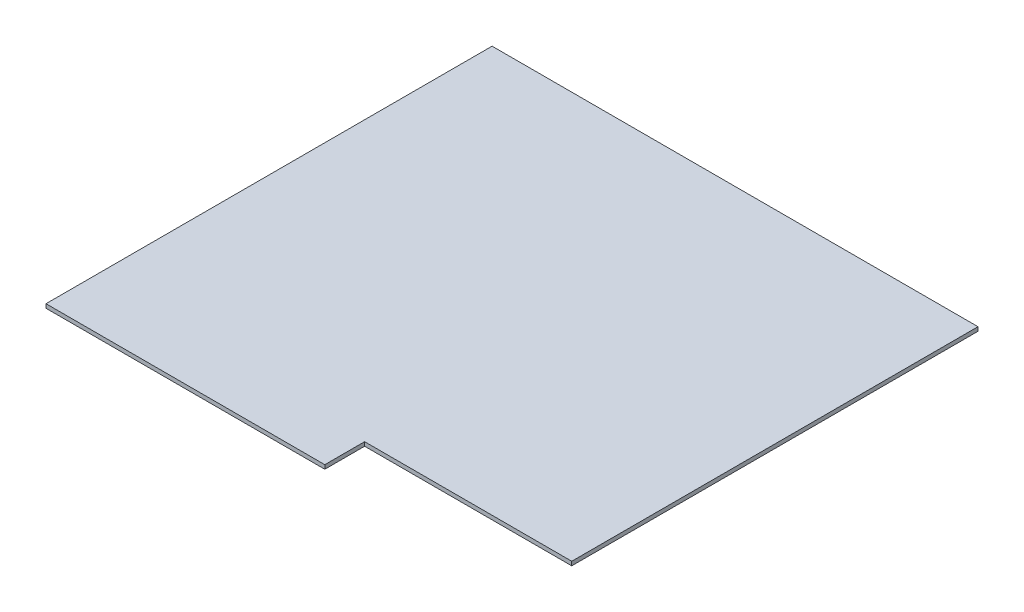
ISO-10303-21;
HEADER;
FILE_DESCRIPTION(('STEP AP214'),'2;1');
FILE_NAME('part.step','',(''),(''),'','','');
FILE_SCHEMA(('AUTOMOTIVE_DESIGN { 1 0 10303 214 1 1 1 1 }'));
ENDSEC;
DATA;
#1=APPLICATION_CONTEXT('core data for automotive mechanical design processes');
#2=APPLICATION_PROTOCOL_DEFINITION('international standard','automotive_design',2000,#1);
#3=PRODUCT_CONTEXT('',#1,'mechanical');
#4=PRODUCT('Part','Part','',(#3));
#5=PRODUCT_RELATED_PRODUCT_CATEGORY('part','',(#4));
#6=PRODUCT_DEFINITION_FORMATION('','',#4);
#7=PRODUCT_DEFINITION_CONTEXT('part definition',#1,'design');
#8=PRODUCT_DEFINITION('design','',#6,#7);
#9=PRODUCT_DEFINITION_SHAPE('','',#8);
#10=(LENGTH_UNIT() NAMED_UNIT(*) SI_UNIT(.MILLI.,.METRE.));
#11=(NAMED_UNIT(*) PLANE_ANGLE_UNIT() SI_UNIT($,.RADIAN.));
#12=(NAMED_UNIT(*) SI_UNIT($,.STERADIAN.) SOLID_ANGLE_UNIT());
#13=UNCERTAINTY_MEASURE_WITH_UNIT(LENGTH_MEASURE(1.E-05),#10,'distance_accuracy_value','');
#14=(GEOMETRIC_REPRESENTATION_CONTEXT(3) GLOBAL_UNCERTAINTY_ASSIGNED_CONTEXT((#13)) GLOBAL_UNIT_ASSIGNED_CONTEXT((#10,
#11,#12)) REPRESENTATION_CONTEXT('',''));
#15=CARTESIAN_POINT('',(0.,0.,0.));
#16=DIRECTION('',(0.,0.,1.));
#17=DIRECTION('',(1.,0.,0.));
#18=AXIS2_PLACEMENT_3D('',#15,#16,#17);
#19=CARTESIAN_POINT('',(-2978.65691651514,50.,2869.08001274914));
#20=DIRECTION('',(1.,0.,0.));
#21=DIRECTION('',(0.,0.,-1.));
#22=AXIS2_PLACEMENT_3D('',#19,#20,#21);
#23=PLANE('',#22);
#24=DIRECTION('',(0.,0.,1.));
#25=VECTOR('',#24,1.);
#26=CARTESIAN_POINT('',(-2978.65691651514,0.,2869.08001274914));
#27=LINE('',#26,#25);
#28=CARTESIAN_POINT('',(-2978.65691651514,0.,-2730.91998725086));
#29=VERTEX_POINT('',#28);
#30=CARTESIAN_POINT('',(-2978.65691651514,0.,2869.08001274914));
#31=VERTEX_POINT('',#30);
#32=EDGE_CURVE('E169',#29,#31,#27,.T.);
#33=ORIENTED_EDGE('',*,*,#32,.T.);
#34=DIRECTION('',(0.,-1.,0.));
#35=VECTOR('',#34,1.);
#36=CARTESIAN_POINT('',(-2978.65691651514,50.,2869.08001274914));
#37=LINE('',#36,#35);
#38=CARTESIAN_POINT('',(-2978.65691651514,50.,2869.08001274914));
#39=VERTEX_POINT('',#38);
#40=EDGE_CURVE('E11',#39,#31,#37,.T.);
#41=ORIENTED_EDGE('',*,*,#40,.F.);
#42=DIRECTION('',(0.,0.,1.));
#43=VECTOR('',#42,1.);
#44=CARTESIAN_POINT('',(-2978.65691651514,50.,2869.08001274914));
#45=LINE('',#44,#43);
#46=CARTESIAN_POINT('',(-2978.65691651514,50.,-2730.91998725086));
#47=VERTEX_POINT('',#46);
#48=EDGE_CURVE('E202',#47,#39,#45,.T.);
#49=ORIENTED_EDGE('',*,*,#48,.F.);
#50=DIRECTION('',(0.,-1.,0.));
#51=VECTOR('',#50,1.);
#52=CARTESIAN_POINT('',(-2978.65691651514,50.,-2730.91998725086));
#53=LINE('',#52,#51);
#54=EDGE_CURVE('E216',#47,#29,#53,.T.);
#55=ORIENTED_EDGE('',*,*,#54,.T.);
#56=EDGE_LOOP('',(#33,#41,#49,#55));
#57=FACE_BOUND('',#56,.T.);
#58=ADVANCED_FACE('F33',(#57),#23,.F.);
#59=CARTESIAN_POINT('',(521.343083484864,50.,2869.08001274914));
#60=DIRECTION('',(0.,0.,-1.));
#61=DIRECTION('',(-1.,0.,0.));
#62=AXIS2_PLACEMENT_3D('',#59,#60,#61);
#63=PLANE('',#62);
#64=DIRECTION('',(1.,0.,0.));
#65=VECTOR('',#64,1.);
#66=CARTESIAN_POINT('',(521.343083484864,0.,2869.08001274914));
#67=LINE('',#66,#65);
#68=CARTESIAN_POINT('',(521.343083484864,0.,2869.08001274914));
#69=VERTEX_POINT('',#68);
#70=EDGE_CURVE('E219',#31,#69,#67,.T.);
#71=ORIENTED_EDGE('',*,*,#70,.T.);
#72=DIRECTION('',(0.,-1.,0.));
#73=VECTOR('',#72,1.);
#74=CARTESIAN_POINT('',(521.343083484864,50.,2869.08001274914));
#75=LINE('',#74,#73);
#76=CARTESIAN_POINT('',(521.343083484864,50.,2869.08001274914));
#77=VERTEX_POINT('',#76);
#78=EDGE_CURVE('E40',#77,#69,#75,.T.);
#79=ORIENTED_EDGE('',*,*,#78,.F.);
#80=DIRECTION('',(1.,0.,0.));
#81=VECTOR('',#80,1.);
#82=CARTESIAN_POINT('',(521.343083484864,50.,2869.08001274914));
#83=LINE('',#82,#81);
#84=EDGE_CURVE('E205',#39,#77,#83,.T.);
#85=ORIENTED_EDGE('',*,*,#84,.F.);
#86=ORIENTED_EDGE('',*,*,#40,.T.);
#87=EDGE_LOOP('',(#71,#79,#85,#86));
#88=FACE_BOUND('',#87,.T.);
#89=ADVANCED_FACE('F266',(#88),#63,.F.);
#90=CARTESIAN_POINT('',(521.343083484864,50.,2369.08001274914));
#91=DIRECTION('',(-1.,0.,0.));
#92=DIRECTION('',(0.,0.,1.));
#93=AXIS2_PLACEMENT_3D('',#90,#91,#92);
#94=PLANE('',#93);
#95=DIRECTION('',(0.,0.,-1.));
#96=VECTOR('',#95,1.);
#97=CARTESIAN_POINT('',(521.343083484864,0.,2369.08001274914));
#98=LINE('',#97,#96);
#99=CARTESIAN_POINT('',(521.343083484864,0.,2369.08001274914));
#100=VERTEX_POINT('',#99);
#101=EDGE_CURVE('E221',#69,#100,#98,.T.);
#102=ORIENTED_EDGE('',*,*,#101,.T.);
#103=DIRECTION('',(0.,-1.,0.));
#104=VECTOR('',#103,1.);
#105=CARTESIAN_POINT('',(521.343083484864,50.,2369.08001274914));
#106=LINE('',#105,#104);
#107=CARTESIAN_POINT('',(521.343083484864,50.,2369.08001274914));
#108=VERTEX_POINT('',#107);
#109=EDGE_CURVE('E236',#108,#100,#106,.T.);
#110=ORIENTED_EDGE('',*,*,#109,.F.);
#111=DIRECTION('',(0.,0.,-1.));
#112=VECTOR('',#111,1.);
#113=CARTESIAN_POINT('',(521.343083484864,50.,2369.08001274914));
#114=LINE('',#113,#112);
#115=EDGE_CURVE('E208',#77,#108,#114,.T.);
#116=ORIENTED_EDGE('',*,*,#115,.F.);
#117=ORIENTED_EDGE('',*,*,#78,.T.);
#118=EDGE_LOOP('',(#102,#110,#116,#117));
#119=FACE_BOUND('',#118,.T.);
#120=ADVANCED_FACE('F243',(#119),#94,.F.);
#121=CARTESIAN_POINT('',(3121.34308348486,50.,2369.08001274914));
#122=DIRECTION('',(0.,0.,-1.));
#123=DIRECTION('',(-1.,0.,0.));
#124=AXIS2_PLACEMENT_3D('',#121,#122,#123);
#125=PLANE('',#124);
#126=DIRECTION('',(1.,0.,0.));
#127=VECTOR('',#126,1.);
#128=CARTESIAN_POINT('',(3121.34308348486,0.,2369.08001274914));
#129=LINE('',#128,#127);
#130=CARTESIAN_POINT('',(3121.34308348486,0.,2369.08001274914));
#131=VERTEX_POINT('',#130);
#132=EDGE_CURVE('E223',#100,#131,#129,.T.);
#133=ORIENTED_EDGE('',*,*,#132,.T.);
#134=DIRECTION('',(0.,-1.,0.));
#135=VECTOR('',#134,1.);
#136=CARTESIAN_POINT('',(3121.34308348486,50.,2369.08001274914));
#137=LINE('',#136,#135);
#138=CARTESIAN_POINT('',(3121.34308348486,50.,2369.08001274914));
#139=VERTEX_POINT('',#138);
#140=EDGE_CURVE('E233',#139,#131,#137,.T.);
#141=ORIENTED_EDGE('',*,*,#140,.F.);
#142=DIRECTION('',(1.,0.,0.));
#143=VECTOR('',#142,1.);
#144=CARTESIAN_POINT('',(3121.34308348486,50.,2369.08001274914));
#145=LINE('',#144,#143);
#146=EDGE_CURVE('E210',#108,#139,#145,.T.);
#147=ORIENTED_EDGE('',*,*,#146,.F.);
#148=ORIENTED_EDGE('',*,*,#109,.T.);
#149=EDGE_LOOP('',(#133,#141,#147,#148));
#150=FACE_BOUND('',#149,.T.);
#151=ADVANCED_FACE('F254',(#150),#125,.F.);
#152=CARTESIAN_POINT('',(3121.34308348486,50.,2369.08001274914));
#153=DIRECTION('',(-1.,0.,0.));
#154=DIRECTION('',(0.,0.,1.));
#155=AXIS2_PLACEMENT_3D('',#152,#153,#154);
#156=PLANE('',#155);
#157=DIRECTION('',(0.,0.,-1.));
#158=VECTOR('',#157,1.);
#159=CARTESIAN_POINT('',(3121.34308348486,0.,2369.08001274914));
#160=LINE('',#159,#158);
#161=CARTESIAN_POINT('',(3121.34308348486,0.,-2730.91998725086));
#162=VERTEX_POINT('',#161);
#163=EDGE_CURVE('E225',#131,#162,#160,.T.);
#164=ORIENTED_EDGE('',*,*,#163,.T.);
#165=DIRECTION('',(0.,-1.,0.));
#166=VECTOR('',#165,1.);
#167=CARTESIAN_POINT('',(3121.34308348486,50.,-2730.91998725086));
#168=LINE('',#167,#166);
#169=CARTESIAN_POINT('',(3121.34308348486,50.,-2730.91998725086));
#170=VERTEX_POINT('',#169);
#171=EDGE_CURVE('E230',#170,#162,#168,.T.);
#172=ORIENTED_EDGE('',*,*,#171,.F.);
#173=DIRECTION('',(0.,0.,-1.));
#174=VECTOR('',#173,1.);
#175=CARTESIAN_POINT('',(3121.34308348486,50.,2369.08001274914));
#176=LINE('',#175,#174);
#177=EDGE_CURVE('E212',#139,#170,#176,.T.);
#178=ORIENTED_EDGE('',*,*,#177,.F.);
#179=ORIENTED_EDGE('',*,*,#140,.T.);
#180=EDGE_LOOP('',(#164,#172,#178,#179));
#181=FACE_BOUND('',#180,.T.);
#182=ADVANCED_FACE('F258',(#181),#156,.F.);
#183=CARTESIAN_POINT('',(3121.34308348486,50.,-2730.91998725086));
#184=DIRECTION('',(0.,0.,1.));
#185=DIRECTION('',(1.,0.,0.));
#186=AXIS2_PLACEMENT_3D('',#183,#184,#185);
#187=PLANE('',#186);
#188=DIRECTION('',(-1.,0.,0.));
#189=VECTOR('',#188,1.);
#190=CARTESIAN_POINT('',(3121.34308348486,0.,-2730.91998725086));
#191=LINE('',#190,#189);
#192=EDGE_CURVE('E206',#162,#29,#191,.T.);
#193=ORIENTED_EDGE('',*,*,#192,.T.);
#194=ORIENTED_EDGE('',*,*,#54,.F.);
#195=DIRECTION('',(-1.,0.,0.));
#196=VECTOR('',#195,1.);
#197=CARTESIAN_POINT('',(3121.34308348486,50.,-2730.91998725086));
#198=LINE('',#197,#196);
#199=EDGE_CURVE('E214',#170,#47,#198,.T.);
#200=ORIENTED_EDGE('',*,*,#199,.F.);
#201=ORIENTED_EDGE('',*,*,#171,.T.);
#202=EDGE_LOOP('',(#193,#194,#200,#201));
#203=FACE_BOUND('',#202,.T.);
#204=ADVANCED_FACE('F269',(#203),#187,.F.);
#205=CARTESIAN_POINT('',(0.,50.,0.));
#206=DIRECTION('',(0.,1.,0.));
#207=DIRECTION('',(0.,0.,1.));
#208=AXIS2_PLACEMENT_3D('',#205,#206,#207);
#209=PLANE('',#208);
#210=ORIENTED_EDGE('',*,*,#48,.T.);
#211=ORIENTED_EDGE('',*,*,#84,.T.);
#212=ORIENTED_EDGE('',*,*,#115,.T.);
#213=ORIENTED_EDGE('',*,*,#146,.T.);
#214=ORIENTED_EDGE('',*,*,#177,.T.);
#215=ORIENTED_EDGE('',*,*,#199,.T.);
#216=EDGE_LOOP('',(#210,#211,#212,#213,#214,#215));
#217=FACE_BOUND('',#216,.T.);
#218=ADVANCED_FACE('F262',(#217),#209,.T.);
#219=CARTESIAN_POINT('',(0.,0.,0.));
#220=DIRECTION('',(0.,1.,0.));
#221=DIRECTION('',(0.,0.,1.));
#222=AXIS2_PLACEMENT_3D('',#219,#220,#221);
#223=PLANE('',#222);
#224=DIRECTION('',(-1.,0.,0.));
#225=VECTOR('',#224,1.);
#226=CARTESIAN_POINT('',(-1828.65691651514,0.,194.080012749139));
#227=LINE('',#226,#225);
#228=CARTESIAN_POINT('',(-1078.65691651514,0.,194.080012749139));
#229=VERTEX_POINT('',#228);
#230=CARTESIAN_POINT('',(-1828.65691651514,0.,194.080012749139));
#231=VERTEX_POINT('',#230);
#232=EDGE_CURVE('E162',#229,#231,#227,.T.);
#233=ORIENTED_EDGE('',*,*,#232,.F.);
#234=DIRECTION('',(0.,0.,1.));
#235=VECTOR('',#234,1.);
#236=CARTESIAN_POINT('',(-1078.65691651514,0.,-555.919987250861));
#237=LINE('',#236,#235);
#238=CARTESIAN_POINT('',(-1078.65691651514,0.,-555.919987250861));
#239=VERTEX_POINT('',#238);
#240=EDGE_CURVE('E47',#239,#229,#237,.T.);
#241=ORIENTED_EDGE('',*,*,#240,.F.);
#242=DIRECTION('',(1.,0.,0.));
#243=VECTOR('',#242,1.);
#244=CARTESIAN_POINT('',(-1828.65691651514,0.,-555.919987250861));
#245=LINE('',#244,#243);
#246=CARTESIAN_POINT('',(-1828.65691651514,0.,-555.919987250861));
#247=VERTEX_POINT('',#246);
#248=EDGE_CURVE('E153',#247,#239,#245,.T.);
#249=ORIENTED_EDGE('',*,*,#248,.F.);
#250=DIRECTION('',(0.,0.,-1.));
#251=VECTOR('',#250,1.);
#252=CARTESIAN_POINT('',(-1828.65691651514,0.,-555.919987250861));
#253=LINE('',#252,#251);
#254=EDGE_CURVE('E156',#231,#247,#253,.T.);
#255=ORIENTED_EDGE('',*,*,#254,.F.);
#256=EDGE_LOOP('',(#233,#241,#249,#255));
#257=FACE_BOUND('',#256,.T.);
#258=DIRECTION('',(1.,0.,0.));
#259=VECTOR('',#258,1.);
#260=CARTESIAN_POINT('',(1971.34308348486,0.,-555.91998725086));
#261=LINE('',#260,#259);
#262=CARTESIAN_POINT('',(1221.34308348486,0.,-555.919987250861));
#263=VERTEX_POINT('',#262);
#264=CARTESIAN_POINT('',(1971.34308348486,0.,-555.91998725086));
#265=VERTEX_POINT('',#264);
#266=EDGE_CURVE('E188',#263,#265,#261,.T.);
#267=ORIENTED_EDGE('',*,*,#266,.F.);
#268=DIRECTION('',(0.,0.,-1.));
#269=VECTOR('',#268,1.);
#270=CARTESIAN_POINT('',(1221.34308348486,0.,-555.919987250861));
#271=LINE('',#270,#269);
#272=CARTESIAN_POINT('',(1221.34308348486,0.,194.080012749139));
#273=VERTEX_POINT('',#272);
#274=EDGE_CURVE('E55',#273,#263,#271,.T.);
#275=ORIENTED_EDGE('',*,*,#274,.F.);
#276=DIRECTION('',(-1.,0.,0.));
#277=VECTOR('',#276,1.);
#278=CARTESIAN_POINT('',(1971.34308348486,0.,194.08001274914));
#279=LINE('',#278,#277);
#280=CARTESIAN_POINT('',(1971.34308348486,0.,194.08001274914));
#281=VERTEX_POINT('',#280);
#282=EDGE_CURVE('E177',#281,#273,#279,.T.);
#283=ORIENTED_EDGE('',*,*,#282,.F.);
#284=DIRECTION('',(0.,0.,1.));
#285=VECTOR('',#284,1.);
#286=CARTESIAN_POINT('',(1971.34308348486,0.,-555.91998725086));
#287=LINE('',#286,#285);
#288=EDGE_CURVE('E191',#265,#281,#287,.T.);
#289=ORIENTED_EDGE('',*,*,#288,.F.);
#290=EDGE_LOOP('',(#267,#275,#283,#289));
#291=FACE_BOUND('',#290,.T.);
#292=ORIENTED_EDGE('',*,*,#32,.F.);
#293=ORIENTED_EDGE('',*,*,#192,.F.);
#294=ORIENTED_EDGE('',*,*,#163,.F.);
#295=ORIENTED_EDGE('',*,*,#132,.F.);
#296=ORIENTED_EDGE('',*,*,#101,.F.);
#297=ORIENTED_EDGE('',*,*,#70,.F.);
#298=EDGE_LOOP('',(#292,#293,#294,#295,#296,#297));
#299=FACE_BOUND('',#298,.T.);
#300=ADVANCED_FACE('F249',(#257,#291,#299),#223,.F.);
#301=CARTESIAN_POINT('',(1221.34308348486,10.,-555.919987250861));
#302=DIRECTION('',(-1.,0.,0.));
#303=DIRECTION('',(0.,0.,1.));
#304=AXIS2_PLACEMENT_3D('',#301,#302,#303);
#305=PLANE('',#304);
#306=ORIENTED_EDGE('',*,*,#274,.T.);
#307=DIRECTION('',(0.,-1.,0.));
#308=VECTOR('',#307,1.);
#309=CARTESIAN_POINT('',(1221.34308348486,10.,-555.919987250861));
#310=LINE('',#309,#308);
#311=CARTESIAN_POINT('',(1221.34308348486,10.,-555.919987250861));
#312=VERTEX_POINT('',#311);
#313=EDGE_CURVE('E186',#312,#263,#310,.T.);
#314=ORIENTED_EDGE('',*,*,#313,.F.);
#315=DIRECTION('',(0.,0.,-1.));
#316=VECTOR('',#315,1.);
#317=CARTESIAN_POINT('',(1221.34308348486,10.,-555.919987250861));
#318=LINE('',#317,#316);
#319=CARTESIAN_POINT('',(1221.34308348486,10.,194.080012749139));
#320=VERTEX_POINT('',#319);
#321=EDGE_CURVE('E173',#320,#312,#318,.T.);
#322=ORIENTED_EDGE('',*,*,#321,.F.);
#323=DIRECTION('',(0.,-1.,0.));
#324=VECTOR('',#323,1.);
#325=CARTESIAN_POINT('',(1221.34308348486,10.,194.080012749139));
#326=LINE('',#325,#324);
#327=EDGE_CURVE('E163',#320,#273,#326,.T.);
#328=ORIENTED_EDGE('',*,*,#327,.T.);
#329=EDGE_LOOP('',(#306,#314,#322,#328));
#330=FACE_BOUND('',#329,.T.);
#331=ADVANCED_FACE('F316',(#330),#305,.F.);
#332=CARTESIAN_POINT('',(1971.34308348486,10.,194.08001274914));
#333=DIRECTION('',(0.,0.,1.));
#334=DIRECTION('',(1.,0.,0.));
#335=AXIS2_PLACEMENT_3D('',#332,#333,#334);
#336=PLANE('',#335);
#337=ORIENTED_EDGE('',*,*,#282,.T.);
#338=ORIENTED_EDGE('',*,*,#327,.F.);
#339=DIRECTION('',(-1.,0.,0.));
#340=VECTOR('',#339,1.);
#341=CARTESIAN_POINT('',(1971.34308348486,10.,194.08001274914));
#342=LINE('',#341,#340);
#343=CARTESIAN_POINT('',(1971.34308348486,10.,194.08001274914));
#344=VERTEX_POINT('',#343);
#345=EDGE_CURVE('E183',#344,#320,#342,.T.);
#346=ORIENTED_EDGE('',*,*,#345,.F.);
#347=DIRECTION('',(0.,-1.,0.));
#348=VECTOR('',#347,1.);
#349=CARTESIAN_POINT('',(1971.34308348486,10.,194.08001274914));
#350=LINE('',#349,#348);
#351=EDGE_CURVE('E197',#344,#281,#350,.T.);
#352=ORIENTED_EDGE('',*,*,#351,.T.);
#353=EDGE_LOOP('',(#337,#338,#346,#352));
#354=FACE_BOUND('',#353,.T.);
#355=ADVANCED_FACE('F325',(#354),#336,.F.);
#356=CARTESIAN_POINT('',(1971.34308348486,10.,-555.91998725086));
#357=DIRECTION('',(1.,0.,0.));
#358=DIRECTION('',(0.,0.,-1.));
#359=AXIS2_PLACEMENT_3D('',#356,#357,#358);
#360=PLANE('',#359);
#361=ORIENTED_EDGE('',*,*,#288,.T.);
#362=ORIENTED_EDGE('',*,*,#351,.F.);
#363=DIRECTION('',(0.,0.,1.));
#364=VECTOR('',#363,1.);
#365=CARTESIAN_POINT('',(1971.34308348486,10.,-555.91998725086));
#366=LINE('',#365,#364);
#367=CARTESIAN_POINT('',(1971.34308348486,10.,-555.91998725086));
#368=VERTEX_POINT('',#367);
#369=EDGE_CURVE('E180',#368,#344,#366,.T.);
#370=ORIENTED_EDGE('',*,*,#369,.F.);
#371=DIRECTION('',(0.,-1.,0.));
#372=VECTOR('',#371,1.);
#373=CARTESIAN_POINT('',(1971.34308348486,10.,-555.91998725086));
#374=LINE('',#373,#372);
#375=EDGE_CURVE('E199',#368,#265,#374,.T.);
#376=ORIENTED_EDGE('',*,*,#375,.T.);
#377=EDGE_LOOP('',(#361,#362,#370,#376));
#378=FACE_BOUND('',#377,.T.);
#379=ADVANCED_FACE('F334',(#378),#360,.F.);
#380=CARTESIAN_POINT('',(1971.34308348486,10.,-555.91998725086));
#381=DIRECTION('',(0.,0.,-1.));
#382=DIRECTION('',(-1.,0.,0.));
#383=AXIS2_PLACEMENT_3D('',#380,#381,#382);
#384=PLANE('',#383);
#385=ORIENTED_EDGE('',*,*,#266,.T.);
#386=ORIENTED_EDGE('',*,*,#375,.F.);
#387=DIRECTION('',(1.,0.,0.));
#388=VECTOR('',#387,1.);
#389=CARTESIAN_POINT('',(1971.34308348486,10.,-555.91998725086));
#390=LINE('',#389,#388);
#391=EDGE_CURVE('E176',#312,#368,#390,.T.);
#392=ORIENTED_EDGE('',*,*,#391,.F.);
#393=ORIENTED_EDGE('',*,*,#313,.T.);
#394=EDGE_LOOP('',(#385,#386,#392,#393));
#395=FACE_BOUND('',#394,.T.);
#396=ADVANCED_FACE('F344',(#395),#384,.F.);
#397=CARTESIAN_POINT('',(0.,10.,0.));
#398=DIRECTION('',(0.,-1.,0.));
#399=DIRECTION('',(0.,0.,-1.));
#400=AXIS2_PLACEMENT_3D('',#397,#398,#399);
#401=PLANE('',#400);
#402=ORIENTED_EDGE('',*,*,#321,.T.);
#403=ORIENTED_EDGE('',*,*,#391,.T.);
#404=ORIENTED_EDGE('',*,*,#369,.T.);
#405=ORIENTED_EDGE('',*,*,#345,.T.);
#406=EDGE_LOOP('',(#402,#403,#404,#405));
#407=FACE_BOUND('',#406,.T.);
#408=ADVANCED_FACE('F354',(#407),#401,.T.);
#409=CARTESIAN_POINT('',(-1078.65691651514,10.,-555.919987250861));
#410=DIRECTION('',(1.,0.,0.));
#411=DIRECTION('',(0.,0.,-1.));
#412=AXIS2_PLACEMENT_3D('',#409,#410,#411);
#413=PLANE('',#412);
#414=ORIENTED_EDGE('',*,*,#240,.T.);
#415=DIRECTION('',(0.,-1.,0.));
#416=VECTOR('',#415,1.);
#417=CARTESIAN_POINT('',(-1078.65691651514,10.,194.080012749139));
#418=LINE('',#417,#416);
#419=CARTESIAN_POINT('',(-1078.65691651514,10.,194.080012749139));
#420=VERTEX_POINT('',#419);
#421=EDGE_CURVE('E131',#420,#229,#418,.T.);
#422=ORIENTED_EDGE('',*,*,#421,.F.);
#423=DIRECTION('',(0.,0.,1.));
#424=VECTOR('',#423,1.);
#425=CARTESIAN_POINT('',(-1078.65691651514,10.,-555.919987250861));
#426=LINE('',#425,#424);
#427=CARTESIAN_POINT('',(-1078.65691651514,10.,-555.919987250861));
#428=VERTEX_POINT('',#427);
#429=EDGE_CURVE('E135',#428,#420,#426,.T.);
#430=ORIENTED_EDGE('',*,*,#429,.F.);
#431=DIRECTION('',(0.,-1.,0.));
#432=VECTOR('',#431,1.);
#433=CARTESIAN_POINT('',(-1078.65691651514,10.,-555.919987250861));
#434=LINE('',#433,#432);
#435=EDGE_CURVE('E167',#428,#239,#434,.T.);
#436=ORIENTED_EDGE('',*,*,#435,.T.);
#437=EDGE_LOOP('',(#414,#422,#430,#436));
#438=FACE_BOUND('',#437,.T.);
#439=ADVANCED_FACE('F133',(#438),#413,.F.);
#440=CARTESIAN_POINT('',(-1828.65691651514,10.,-555.919987250861));
#441=DIRECTION('',(0.,0.,-1.));
#442=DIRECTION('',(-1.,0.,0.));
#443=AXIS2_PLACEMENT_3D('',#440,#441,#442);
#444=PLANE('',#443);
#445=ORIENTED_EDGE('',*,*,#248,.T.);
#446=ORIENTED_EDGE('',*,*,#435,.F.);
#447=DIRECTION('',(1.,0.,0.));
#448=VECTOR('',#447,1.);
#449=CARTESIAN_POINT('',(-1828.65691651514,10.,-555.919987250861));
#450=LINE('',#449,#448);
#451=CARTESIAN_POINT('',(-1828.65691651514,10.,-555.919987250861));
#452=VERTEX_POINT('',#451);
#453=EDGE_CURVE('E141',#452,#428,#450,.T.);
#454=ORIENTED_EDGE('',*,*,#453,.F.);
#455=DIRECTION('',(0.,-1.,0.));
#456=VECTOR('',#455,1.);
#457=CARTESIAN_POINT('',(-1828.65691651514,10.,-555.919987250861));
#458=LINE('',#457,#456);
#459=EDGE_CURVE('E170',#452,#247,#458,.T.);
#460=ORIENTED_EDGE('',*,*,#459,.T.);
#461=EDGE_LOOP('',(#445,#446,#454,#460));
#462=FACE_BOUND('',#461,.T.);
#463=ADVANCED_FACE('F373',(#462),#444,.F.);
#464=CARTESIAN_POINT('',(-1828.65691651514,10.,-555.919987250861));
#465=DIRECTION('',(-1.,0.,0.));
#466=DIRECTION('',(0.,0.,1.));
#467=AXIS2_PLACEMENT_3D('',#464,#465,#466);
#468=PLANE('',#467);
#469=ORIENTED_EDGE('',*,*,#254,.T.);
#470=ORIENTED_EDGE('',*,*,#459,.F.);
#471=DIRECTION('',(0.,0.,-1.));
#472=VECTOR('',#471,1.);
#473=CARTESIAN_POINT('',(-1828.65691651514,10.,-555.919987250861));
#474=LINE('',#473,#472);
#475=CARTESIAN_POINT('',(-1828.65691651514,10.,194.080012749139));
#476=VERTEX_POINT('',#475);
#477=EDGE_CURVE('E149',#476,#452,#474,.T.);
#478=ORIENTED_EDGE('',*,*,#477,.F.);
#479=DIRECTION('',(0.,-1.,0.));
#480=VECTOR('',#479,1.);
#481=CARTESIAN_POINT('',(-1828.65691651514,10.,194.080012749139));
#482=LINE('',#481,#480);
#483=EDGE_CURVE('E140',#476,#231,#482,.T.);
#484=ORIENTED_EDGE('',*,*,#483,.T.);
#485=EDGE_LOOP('',(#469,#470,#478,#484));
#486=FACE_BOUND('',#485,.T.);
#487=ADVANCED_FACE('F382',(#486),#468,.F.);
#488=CARTESIAN_POINT('',(-1828.65691651514,10.,194.080012749139));
#489=DIRECTION('',(0.,0.,1.));
#490=DIRECTION('',(1.,0.,0.));
#491=AXIS2_PLACEMENT_3D('',#488,#489,#490);
#492=PLANE('',#491);
#493=ORIENTED_EDGE('',*,*,#232,.T.);
#494=ORIENTED_EDGE('',*,*,#483,.F.);
#495=DIRECTION('',(-1.,0.,0.));
#496=VECTOR('',#495,1.);
#497=CARTESIAN_POINT('',(-1828.65691651514,10.,194.080012749139));
#498=LINE('',#497,#496);
#499=EDGE_CURVE('E144',#420,#476,#498,.T.);
#500=ORIENTED_EDGE('',*,*,#499,.F.);
#501=ORIENTED_EDGE('',*,*,#421,.T.);
#502=EDGE_LOOP('',(#493,#494,#500,#501));
#503=FACE_BOUND('',#502,.T.);
#504=ADVANCED_FACE('F145',(#503),#492,.F.);
#505=CARTESIAN_POINT('',(0.,10.,0.));
#506=DIRECTION('',(0.,1.,0.));
#507=DIRECTION('',(0.,0.,1.));
#508=AXIS2_PLACEMENT_3D('',#505,#506,#507);
#509=PLANE('',#508);
#510=ORIENTED_EDGE('',*,*,#429,.T.);
#511=ORIENTED_EDGE('',*,*,#499,.T.);
#512=ORIENTED_EDGE('',*,*,#477,.T.);
#513=ORIENTED_EDGE('',*,*,#453,.T.);
#514=EDGE_LOOP('',(#510,#511,#512,#513));
#515=FACE_BOUND('',#514,.T.);
#516=ADVANCED_FACE('F151',(#515),#509,.F.);
#517=CLOSED_SHELL('',(#58,#89,#120,#151,#182,#204,#218,#300,#331,#355,#379,#396,#408,#439,#463,
#487,#504,#516));
#518=MANIFOLD_SOLID_BREP('B2',#517);
#519=ADVANCED_BREP_SHAPE_REPRESENTATION('',(#18,#518),#14);
#520=SHAPE_DEFINITION_REPRESENTATION(#9,#519);
ENDSEC;
END-ISO-10303-21;
